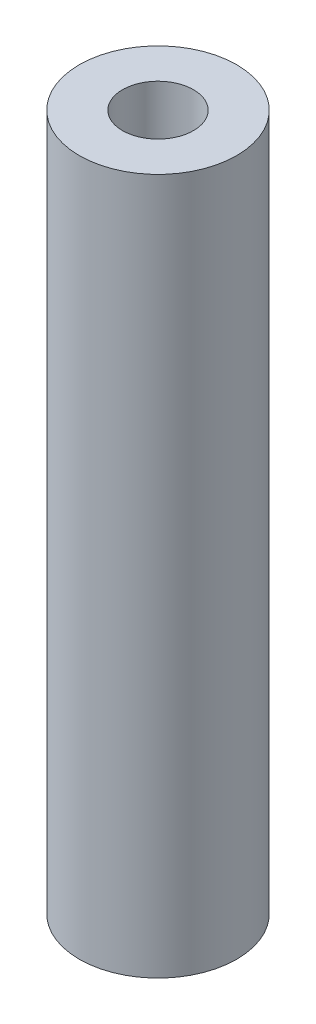
ISO-10303-21;
HEADER;
FILE_DESCRIPTION(('STEP AP214'),'2;1');
FILE_NAME('part.step','',(''),(''),'','','');
FILE_SCHEMA(('AUTOMOTIVE_DESIGN { 1 0 10303 214 1 1 1 1 }'));
ENDSEC;
DATA;
#1=APPLICATION_CONTEXT('core data for automotive mechanical design processes');
#2=APPLICATION_PROTOCOL_DEFINITION('international standard','automotive_design',2000,#1);
#3=PRODUCT_CONTEXT('',#1,'mechanical');
#4=PRODUCT('Part','Part','',(#3));
#5=PRODUCT_RELATED_PRODUCT_CATEGORY('part','',(#4));
#6=PRODUCT_DEFINITION_FORMATION('','',#4);
#7=PRODUCT_DEFINITION_CONTEXT('part definition',#1,'design');
#8=PRODUCT_DEFINITION('design','',#6,#7);
#9=PRODUCT_DEFINITION_SHAPE('','',#8);
#10=(LENGTH_UNIT() NAMED_UNIT(*) SI_UNIT(.MILLI.,.METRE.));
#11=(NAMED_UNIT(*) PLANE_ANGLE_UNIT() SI_UNIT($,.RADIAN.));
#12=(NAMED_UNIT(*) SI_UNIT($,.STERADIAN.) SOLID_ANGLE_UNIT());
#13=UNCERTAINTY_MEASURE_WITH_UNIT(LENGTH_MEASURE(1.E-05),#10,'distance_accuracy_value','');
#14=(GEOMETRIC_REPRESENTATION_CONTEXT(3) GLOBAL_UNCERTAINTY_ASSIGNED_CONTEXT((#13)) GLOBAL_UNIT_ASSIGNED_CONTEXT((#10,
#11,#12)) REPRESENTATION_CONTEXT('',''));
#15=CARTESIAN_POINT('',(0.,0.,0.));
#16=DIRECTION('',(0.,0.,1.));
#17=DIRECTION('',(1.,0.,0.));
#18=AXIS2_PLACEMENT_3D('',#15,#16,#17);
#19=CARTESIAN_POINT('',(0.,26.53,0.));
#20=DIRECTION('',(0.,-1.,0.));
#21=DIRECTION('',(0.,0.,-1.));
#22=AXIS2_PLACEMENT_3D('',#19,#20,#21);
#23=CYLINDRICAL_SURFACE('',#22,3.);
#24=CARTESIAN_POINT('',(0.,26.53,0.));
#25=DIRECTION('',(0.,1.,0.));
#26=DIRECTION('',(0.,0.,1.));
#27=AXIS2_PLACEMENT_3D('',#24,#25,#26);
#28=CIRCLE('',#27,3.);
#29=CARTESIAN_POINT('',(0.,26.53,3.));
#30=VERTEX_POINT('',#29);
#31=EDGE_CURVE('E11',#30,#30,#28,.T.);
#32=ORIENTED_EDGE('',*,*,#31,.F.);
#33=EDGE_LOOP('',(#32));
#34=FACE_BOUND('',#33,.T.);
#35=CARTESIAN_POINT('',(0.,0.,0.));
#36=DIRECTION('',(0.,1.,0.));
#37=DIRECTION('',(0.,0.,1.));
#38=AXIS2_PLACEMENT_3D('',#35,#36,#37);
#39=CIRCLE('',#38,3.);
#40=CARTESIAN_POINT('',(0.,0.,3.));
#41=VERTEX_POINT('',#40);
#42=EDGE_CURVE('E40',#41,#41,#39,.T.);
#43=ORIENTED_EDGE('',*,*,#42,.T.);
#44=EDGE_LOOP('',(#43));
#45=FACE_BOUND('',#44,.T.);
#46=ADVANCED_FACE('F37',(#34,#45),#23,.T.);
#47=CARTESIAN_POINT('',(0.,26.53,0.));
#48=DIRECTION('',(0.,1.,0.));
#49=DIRECTION('',(0.,0.,1.));
#50=AXIS2_PLACEMENT_3D('',#47,#48,#49);
#51=PLANE('',#50);
#52=CARTESIAN_POINT('',(0.,26.53,0.));
#53=DIRECTION('',(0.,1.,0.));
#54=DIRECTION('',(0.,0.,1.));
#55=AXIS2_PLACEMENT_3D('',#52,#53,#54);
#56=CIRCLE('',#55,1.35254999999999);
#57=CARTESIAN_POINT('',(0.,26.53,1.35254999999999));
#58=VERTEX_POINT('',#57);
#59=EDGE_CURVE('E60',#58,#58,#56,.T.);
#60=ORIENTED_EDGE('',*,*,#59,.F.);
#61=EDGE_LOOP('',(#60));
#62=FACE_BOUND('',#61,.T.);
#63=ORIENTED_EDGE('',*,*,#31,.T.);
#64=EDGE_LOOP('',(#63));
#65=FACE_BOUND('',#64,.T.);
#66=ADVANCED_FACE('F79',(#62,#65),#51,.T.);
#67=CARTESIAN_POINT('',(0.,0.,0.));
#68=DIRECTION('',(0.,1.,0.));
#69=DIRECTION('',(0.,0.,1.));
#70=AXIS2_PLACEMENT_3D('',#67,#68,#69);
#71=PLANE('',#70);
#72=CARTESIAN_POINT('',(0.,0.,0.));
#73=DIRECTION('',(0.,-1.,0.));
#74=DIRECTION('',(0.,0.,-1.));
#75=AXIS2_PLACEMENT_3D('',#72,#73,#74);
#76=CIRCLE('',#75,1.35254999999999);
#77=CARTESIAN_POINT('',(0.,0.,-1.35254999999999));
#78=VERTEX_POINT('',#77);
#79=EDGE_CURVE('E61',#78,#78,#76,.T.);
#80=ORIENTED_EDGE('',*,*,#79,.F.);
#81=EDGE_LOOP('',(#80));
#82=FACE_BOUND('',#81,.T.);
#83=ORIENTED_EDGE('',*,*,#42,.F.);
#84=EDGE_LOOP('',(#83));
#85=FACE_BOUND('',#84,.T.);
#86=ADVANCED_FACE('F76',(#82,#85),#71,.F.);
#87=CARTESIAN_POINT('',(0.,16.53,0.));
#88=DIRECTION('',(0.,1.,0.));
#89=DIRECTION('',(0.,0.,1.));
#90=AXIS2_PLACEMENT_3D('',#87,#88,#89);
#91=CONICAL_SURFACE('',#90,1.35255,1.02974425867665);
#92=CARTESIAN_POINT('',(0.,15.7173059697343,0.));
#93=VERTEX_POINT('',#92);
#94=VERTEX_LOOP('',#93);
#95=FACE_BOUND('',#94,.T.);
#96=CARTESIAN_POINT('',(0.,16.53,0.));
#97=DIRECTION('',(0.,1.,0.));
#98=DIRECTION('',(0.,0.,1.));
#99=AXIS2_PLACEMENT_3D('',#96,#97,#98);
#100=CIRCLE('',#99,1.35255);
#101=CARTESIAN_POINT('',(0.,16.53,1.35255));
#102=VERTEX_POINT('',#101);
#103=EDGE_CURVE('E64',#102,#102,#100,.T.);
#104=ORIENTED_EDGE('',*,*,#103,.T.);
#105=EDGE_LOOP('',(#104));
#106=FACE_BOUND('',#105,.T.);
#107=ADVANCED_FACE('F78',(#95,#106),#91,.F.);
#108=CARTESIAN_POINT('',(0.,26.53,0.));
#109=DIRECTION('',(0.,1.,0.));
#110=DIRECTION('',(0.,0.,1.));
#111=AXIS2_PLACEMENT_3D('',#108,#109,#110);
#112=CYLINDRICAL_SURFACE('',#111,1.35254999999999);
#113=ORIENTED_EDGE('',*,*,#103,.F.);
#114=EDGE_LOOP('',(#113));
#115=FACE_BOUND('',#114,.T.);
#116=ORIENTED_EDGE('',*,*,#59,.T.);
#117=EDGE_LOOP('',(#116));
#118=FACE_BOUND('',#117,.T.);
#119=ADVANCED_FACE('F54',(#115,#118),#112,.F.);
#120=CARTESIAN_POINT('',(0.,9.99999999999999,0.));
#121=DIRECTION('',(0.,-1.,0.));
#122=DIRECTION('',(0.,0.,-1.));
#123=AXIS2_PLACEMENT_3D('',#120,#121,#122);
#124=CONICAL_SURFACE('',#123,1.35254999999999,1.02974425867665);
#125=CARTESIAN_POINT('',(0.,10.8126940302657,0.));
#126=VERTEX_POINT('',#125);
#127=VERTEX_LOOP('',#126);
#128=FACE_BOUND('',#127,.T.);
#129=CARTESIAN_POINT('',(0.,9.99999999999999,0.));
#130=DIRECTION('',(0.,-1.,0.));
#131=DIRECTION('',(0.,0.,-1.));
#132=AXIS2_PLACEMENT_3D('',#129,#130,#131);
#133=CIRCLE('',#132,1.35254999999999);
#134=CARTESIAN_POINT('',(0.,9.99999999999999,-1.35254999999999));
#135=VERTEX_POINT('',#134);
#136=EDGE_CURVE('E58',#135,#135,#133,.T.);
#137=ORIENTED_EDGE('',*,*,#136,.T.);
#138=EDGE_LOOP('',(#137));
#139=FACE_BOUND('',#138,.T.);
#140=ADVANCED_FACE('F50',(#128,#139),#124,.F.);
#141=CARTESIAN_POINT('',(0.,0.,0.));
#142=DIRECTION('',(0.,-1.,0.));
#143=DIRECTION('',(0.,0.,-1.));
#144=AXIS2_PLACEMENT_3D('',#141,#142,#143);
#145=CYLINDRICAL_SURFACE('',#144,1.35254999999999);
#146=ORIENTED_EDGE('',*,*,#136,.F.);
#147=EDGE_LOOP('',(#146));
#148=FACE_BOUND('',#147,.T.);
#149=ORIENTED_EDGE('',*,*,#79,.T.);
#150=EDGE_LOOP('',(#149));
#151=FACE_BOUND('',#150,.T.);
#152=ADVANCED_FACE('F53',(#148,#151),#145,.F.);
#153=CLOSED_SHELL('',(#46,#66,#86,#107,#119,#140,#152));
#154=MANIFOLD_SOLID_BREP('B2',#153);
#155=ADVANCED_BREP_SHAPE_REPRESENTATION('',(#18,#154),#14);
#156=SHAPE_DEFINITION_REPRESENTATION(#9,#155);
ENDSEC;
END-ISO-10303-21;
